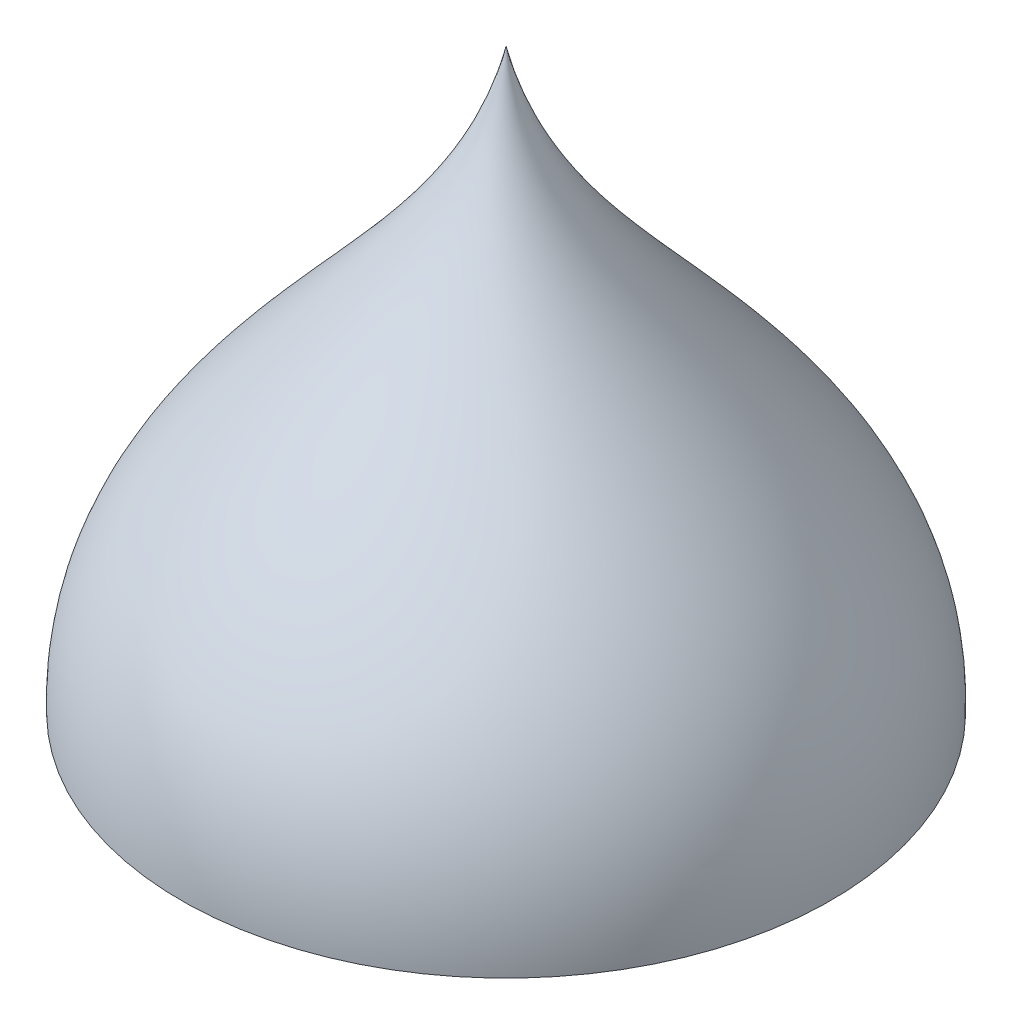
ISO-10303-21;
HEADER;
FILE_DESCRIPTION(('STEP AP214'),'2;1');
FILE_NAME('part.step','',(''),(''),'','','');
FILE_SCHEMA(('AUTOMOTIVE_DESIGN { 1 0 10303 214 1 1 1 1 }'));
ENDSEC;
DATA;
#1=APPLICATION_CONTEXT('core data for automotive mechanical design processes');
#2=APPLICATION_PROTOCOL_DEFINITION('international standard','automotive_design',2000,#1);
#3=PRODUCT_CONTEXT('',#1,'mechanical');
#4=PRODUCT('Part','Part','',(#3));
#5=PRODUCT_RELATED_PRODUCT_CATEGORY('part','',(#4));
#6=PRODUCT_DEFINITION_FORMATION('','',#4);
#7=PRODUCT_DEFINITION_CONTEXT('part definition',#1,'design');
#8=PRODUCT_DEFINITION('design','',#6,#7);
#9=PRODUCT_DEFINITION_SHAPE('','',#8);
#10=(LENGTH_UNIT() NAMED_UNIT(*) SI_UNIT(.MILLI.,.METRE.));
#11=(NAMED_UNIT(*) PLANE_ANGLE_UNIT() SI_UNIT($,.RADIAN.));
#12=(NAMED_UNIT(*) SI_UNIT($,.STERADIAN.) SOLID_ANGLE_UNIT());
#13=UNCERTAINTY_MEASURE_WITH_UNIT(LENGTH_MEASURE(1.E-05),#10,'distance_accuracy_value','');
#14=(GEOMETRIC_REPRESENTATION_CONTEXT(3) GLOBAL_UNCERTAINTY_ASSIGNED_CONTEXT((#13)) GLOBAL_UNIT_ASSIGNED_CONTEXT((#10,
#11,#12)) REPRESENTATION_CONTEXT('',''));
#15=CARTESIAN_POINT('',(0.,0.,0.));
#16=DIRECTION('',(0.,0.,1.));
#17=DIRECTION('',(1.,0.,0.));
#18=AXIS2_PLACEMENT_3D('',#15,#16,#17);
#19=CARTESIAN_POINT('',(0.,8.,0.));
#20=CARTESIAN_POINT('',(-0.696810991600036,4.89003447213457,0.));
#21=CARTESIAN_POINT('',(-4.61220419736492,3.38327804701324,0.));
#22=CARTESIAN_POINT('',(-4.5,0.,0.));
#23=B_SPLINE_CURVE_WITH_KNOTS('',3,(#19,#20,#21,#22),.UNSPECIFIED.,.F.,.F.,(4,4),(0.,1.),.UNSPECIFIED.);
#24=CARTESIAN_POINT('',(0.,0.,0.));
#25=DIRECTION('',(0.,-1.,0.));
#26=AXIS1_PLACEMENT('',#24,#25);
#27=SURFACE_OF_REVOLUTION('',#23,#26);
#28=CARTESIAN_POINT('',(0.,0.,0.));
#29=DIRECTION('',(0.,-1.,0.));
#30=DIRECTION('',(0.,0.,-1.));
#31=AXIS2_PLACEMENT_3D('',#28,#29,#30);
#32=CIRCLE('',#31,4.5);
#33=CARTESIAN_POINT('',(0.,0.,-4.5));
#34=VERTEX_POINT('',#33);
#35=EDGE_CURVE('E11',#34,#34,#32,.T.);
#36=ORIENTED_EDGE('',*,*,#35,.F.);
#37=EDGE_LOOP('',(#36));
#38=FACE_BOUND('',#37,.T.);
#39=CARTESIAN_POINT('',(0.,8.,0.));
#40=VERTEX_POINT('',#39);
#41=VERTEX_LOOP('',#40);
#42=FACE_BOUND('',#41,.T.);
#43=ADVANCED_FACE('F33',(#38,#42),#27,.T.);
#44=CARTESIAN_POINT('',(-4.5,0.,0.));
#45=DIRECTION('',(0.,1.,0.));
#46=DIRECTION('',(0.,0.,1.));
#47=AXIS2_PLACEMENT_3D('',#44,#45,#46);
#48=PLANE('',#47);
#49=CARTESIAN_POINT('',(0.,0.,0.));
#50=DIRECTION('',(0.,-1.,0.));
#51=DIRECTION('',(0.,0.,-1.));
#52=AXIS2_PLACEMENT_3D('',#49,#50,#51);
#53=CIRCLE('',#52,3.1);
#54=CARTESIAN_POINT('',(0.,0.,-3.1));
#55=VERTEX_POINT('',#54);
#56=EDGE_CURVE('E40',#55,#55,#53,.T.);
#57=ORIENTED_EDGE('',*,*,#56,.F.);
#58=EDGE_LOOP('',(#57));
#59=FACE_BOUND('',#58,.T.);
#60=ORIENTED_EDGE('',*,*,#35,.T.);
#61=EDGE_LOOP('',(#60));
#62=FACE_BOUND('',#61,.T.);
#63=ADVANCED_FACE('F44',(#59,#62),#48,.F.);
#64=CARTESIAN_POINT('',(0.,0.,0.));
#65=DIRECTION('',(0.,-1.,0.));
#66=DIRECTION('',(0.,0.,-1.));
#67=AXIS2_PLACEMENT_3D('',#64,#65,#66);
#68=CYLINDRICAL_SURFACE('',#67,3.1);
#69=CARTESIAN_POINT('',(0.,1.,0.));
#70=DIRECTION('',(0.,-1.,0.));
#71=DIRECTION('',(0.,0.,-1.));
#72=AXIS2_PLACEMENT_3D('',#69,#70,#71);
#73=CIRCLE('',#72,3.1);
#74=CARTESIAN_POINT('',(0.,1.,-3.1));
#75=VERTEX_POINT('',#74);
#76=EDGE_CURVE('E79',#75,#75,#73,.T.);
#77=ORIENTED_EDGE('',*,*,#76,.F.);
#78=EDGE_LOOP('',(#77));
#79=FACE_BOUND('',#78,.T.);
#80=ORIENTED_EDGE('',*,*,#56,.T.);
#81=EDGE_LOOP('',(#80));
#82=FACE_BOUND('',#81,.T.);
#83=ADVANCED_FACE('F49',(#79,#82),#68,.F.);
#84=CARTESIAN_POINT('',(-3.1,1.,0.));
#85=DIRECTION('',(0.,1.,0.));
#86=DIRECTION('',(0.,0.,1.));
#87=AXIS2_PLACEMENT_3D('',#84,#85,#86);
#88=PLANE('',#87);
#89=CARTESIAN_POINT('',(0.,1.,0.));
#90=DIRECTION('',(0.,-1.,0.));
#91=DIRECTION('',(0.,0.,-1.));
#92=AXIS2_PLACEMENT_3D('',#89,#90,#91);
#93=CIRCLE('',#92,2.);
#94=CARTESIAN_POINT('',(0.,1.,-2.));
#95=VERTEX_POINT('',#94);
#96=EDGE_CURVE('E76',#95,#95,#93,.T.);
#97=ORIENTED_EDGE('',*,*,#96,.F.);
#98=EDGE_LOOP('',(#97));
#99=FACE_BOUND('',#98,.T.);
#100=ORIENTED_EDGE('',*,*,#76,.T.);
#101=EDGE_LOOP('',(#100));
#102=FACE_BOUND('',#101,.T.);
#103=ADVANCED_FACE('F56',(#99,#102),#88,.F.);
#104=CARTESIAN_POINT('',(0.,0.,0.));
#105=DIRECTION('',(0.,-1.,0.));
#106=DIRECTION('',(0.,0.,-1.));
#107=AXIS2_PLACEMENT_3D('',#104,#105,#106);
#108=CYLINDRICAL_SURFACE('',#107,2.);
#109=CARTESIAN_POINT('',(0.,0.,0.));
#110=DIRECTION('',(0.,-1.,0.));
#111=DIRECTION('',(0.,0.,-1.));
#112=AXIS2_PLACEMENT_3D('',#109,#110,#111);
#113=CIRCLE('',#112,2.);
#114=CARTESIAN_POINT('',(0.,0.,-2.));
#115=VERTEX_POINT('',#114);
#116=EDGE_CURVE('E75',#115,#115,#113,.T.);
#117=ORIENTED_EDGE('',*,*,#116,.F.);
#118=EDGE_LOOP('',(#117));
#119=FACE_BOUND('',#118,.T.);
#120=ORIENTED_EDGE('',*,*,#96,.T.);
#121=EDGE_LOOP('',(#120));
#122=FACE_BOUND('',#121,.T.);
#123=ADVANCED_FACE('F63',(#119,#122),#108,.T.);
#124=CARTESIAN_POINT('',(-2.,0.,0.));
#125=DIRECTION('',(0.,1.,0.));
#126=DIRECTION('',(0.,0.,1.));
#127=AXIS2_PLACEMENT_3D('',#124,#125,#126);
#128=PLANE('',#127);
#129=ORIENTED_EDGE('',*,*,#116,.T.);
#130=EDGE_LOOP('',(#129));
#131=FACE_BOUND('',#130,.T.);
#132=ADVANCED_FACE('F67',(#131),#128,.F.);
#133=CLOSED_SHELL('',(#43,#63,#83,#103,#123,#132));
#134=MANIFOLD_SOLID_BREP('B2',#133);
#135=ADVANCED_BREP_SHAPE_REPRESENTATION('',(#18,#134),#14);
#136=SHAPE_DEFINITION_REPRESENTATION(#9,#135);
ENDSEC;
END-ISO-10303-21;
